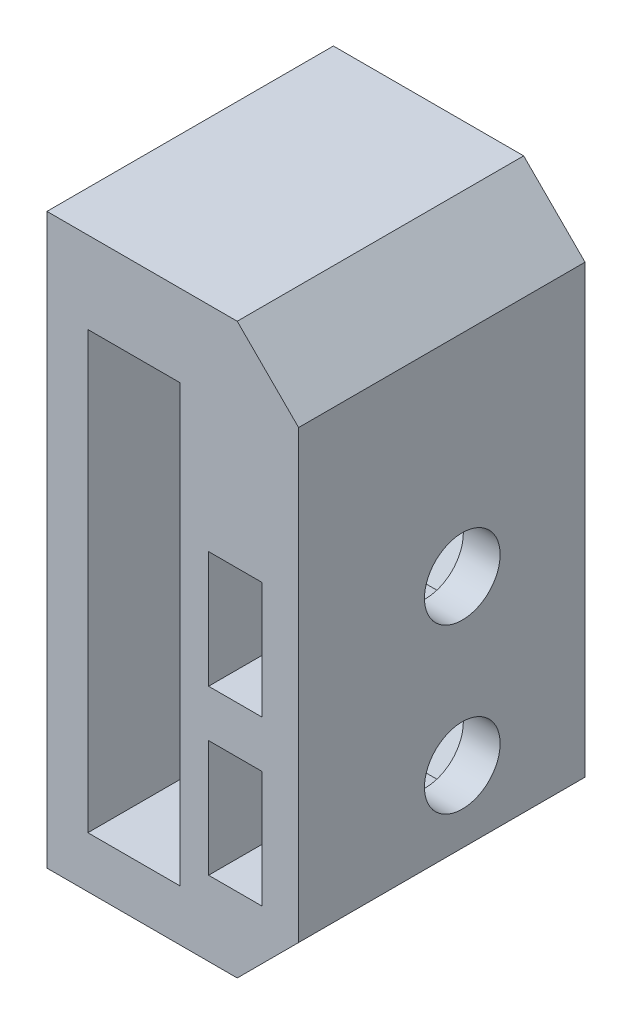
ISO-10303-21;
HEADER;
FILE_DESCRIPTION(('STEP AP214'),'2;1');
FILE_NAME('part.step','',(''),(''),'','','');
FILE_SCHEMA(('AUTOMOTIVE_DESIGN { 1 0 10303 214 1 1 1 1 }'));
ENDSEC;
DATA;
#1=APPLICATION_CONTEXT('core data for automotive mechanical design processes');
#2=APPLICATION_PROTOCOL_DEFINITION('international standard','automotive_design',2000,#1);
#3=PRODUCT_CONTEXT('',#1,'mechanical');
#4=PRODUCT('Part','Part','',(#3));
#5=PRODUCT_RELATED_PRODUCT_CATEGORY('part','',(#4));
#6=PRODUCT_DEFINITION_FORMATION('','',#4);
#7=PRODUCT_DEFINITION_CONTEXT('part definition',#1,'design');
#8=PRODUCT_DEFINITION('design','',#6,#7);
#9=PRODUCT_DEFINITION_SHAPE('','',#8);
#10=(LENGTH_UNIT() NAMED_UNIT(*) SI_UNIT(.MILLI.,.METRE.));
#11=(NAMED_UNIT(*) PLANE_ANGLE_UNIT() SI_UNIT($,.RADIAN.));
#12=(NAMED_UNIT(*) SI_UNIT($,.STERADIAN.) SOLID_ANGLE_UNIT());
#13=UNCERTAINTY_MEASURE_WITH_UNIT(LENGTH_MEASURE(1.E-05),#10,'distance_accuracy_value','');
#14=(GEOMETRIC_REPRESENTATION_CONTEXT(3) GLOBAL_UNCERTAINTY_ASSIGNED_CONTEXT((#13)) GLOBAL_UNIT_ASSIGNED_CONTEXT((#10,
#11,#12)) REPRESENTATION_CONTEXT('',''));
#15=CARTESIAN_POINT('',(0.,0.,0.));
#16=DIRECTION('',(0.,0.,1.));
#17=DIRECTION('',(1.,0.,0.));
#18=AXIS2_PLACEMENT_3D('',#15,#16,#17);
#19=CARTESIAN_POINT('',(8.49999999999995,6.85000000000002,5.02670669525396));
#20=DIRECTION('',(0.,1.,0.));
#21=DIRECTION('',(0.,0.,1.));
#22=AXIS2_PLACEMENT_3D('',#19,#20,#21);
#23=PLANE('',#22);
#24=DIRECTION('',(0.,0.,1.));
#25=VECTOR('',#24,1.);
#26=CARTESIAN_POINT('',(5.90000000000002,6.85000000000002,5.02670669525396));
#27=LINE('',#26,#25);
#28=CARTESIAN_POINT('',(5.90000000000002,6.85000000000002,1.85455173280957));
#29=VERTEX_POINT('',#28);
#30=CARTESIAN_POINT('',(5.90000000000002,6.85000000000002,11.5));
#31=VERTEX_POINT('',#30);
#32=EDGE_CURVE('E299',#29,#31,#27,.T.);
#33=ORIENTED_EDGE('',*,*,#32,.F.);
#34=DIRECTION('',(-1.,0.,0.));
#35=VECTOR('',#34,1.);
#36=CARTESIAN_POINT('',(8.49999999999995,6.85000000000002,1.85455173280957));
#37=LINE('',#36,#35);
#38=CARTESIAN_POINT('',(8.49999999999995,6.85000000000002,1.85455173280957));
#39=VERTEX_POINT('',#38);
#40=EDGE_CURVE('E342',#39,#29,#37,.T.);
#41=ORIENTED_EDGE('',*,*,#40,.F.);
#42=DIRECTION('',(0.,0.,-1.));
#43=VECTOR('',#42,1.);
#44=CARTESIAN_POINT('',(8.49999999999995,6.85000000000002,5.02670669525396));
#45=LINE('',#44,#43);
#46=CARTESIAN_POINT('',(8.49999999999995,6.85000000000002,11.5));
#47=VERTEX_POINT('',#46);
#48=EDGE_CURVE('E309',#47,#39,#45,.T.);
#49=ORIENTED_EDGE('',*,*,#48,.F.);
#50=DIRECTION('',(-1.,0.,0.));
#51=VECTOR('',#50,1.);
#52=CARTESIAN_POINT('',(8.49999999999995,6.85000000000002,11.5));
#53=LINE('',#52,#51);
#54=EDGE_CURVE('E303',#47,#31,#53,.T.);
#55=ORIENTED_EDGE('',*,*,#54,.T.);
#56=EDGE_LOOP('',(#33,#41,#49,#55));
#57=FACE_BOUND('',#56,.T.);
#58=ADVANCED_FACE('F71',(#57),#23,.F.);
#59=CARTESIAN_POINT('',(8.49999999999995,1.14999999999998,11.5));
#60=DIRECTION('',(0.,-1.,0.));
#61=DIRECTION('',(0.,0.,-1.));
#62=AXIS2_PLACEMENT_3D('',#59,#60,#61);
#63=PLANE('',#62);
#64=DIRECTION('',(0.,0.,-1.));
#65=VECTOR('',#64,1.);
#66=CARTESIAN_POINT('',(5.90000000000002,1.14999999999998,11.5));
#67=LINE('',#66,#65);
#68=CARTESIAN_POINT('',(5.90000000000002,1.14999999999998,11.5));
#69=VERTEX_POINT('',#68);
#70=CARTESIAN_POINT('',(5.90000000000002,1.14999999999998,1.85455173280957));
#71=VERTEX_POINT('',#70);
#72=EDGE_CURVE('E295',#69,#71,#67,.T.);
#73=ORIENTED_EDGE('',*,*,#72,.F.);
#74=DIRECTION('',(-1.,0.,0.));
#75=VECTOR('',#74,1.);
#76=CARTESIAN_POINT('',(8.49999999999995,1.14999999999998,11.5));
#77=LINE('',#76,#75);
#78=CARTESIAN_POINT('',(8.49999999999995,1.14999999999998,11.5));
#79=VERTEX_POINT('',#78);
#80=EDGE_CURVE('E355',#79,#69,#77,.T.);
#81=ORIENTED_EDGE('',*,*,#80,.F.);
#82=DIRECTION('',(0.,0.,1.));
#83=VECTOR('',#82,1.);
#84=CARTESIAN_POINT('',(8.49999999999995,1.14999999999998,1.85455173280957));
#85=LINE('',#84,#83);
#86=CARTESIAN_POINT('',(8.49999999999995,1.14999999999998,1.85455173280957));
#87=VERTEX_POINT('',#86);
#88=EDGE_CURVE('E364',#87,#79,#85,.T.);
#89=ORIENTED_EDGE('',*,*,#88,.F.);
#90=DIRECTION('',(-1.,0.,0.));
#91=VECTOR('',#90,1.);
#92=CARTESIAN_POINT('',(8.49999999999995,1.14999999999998,1.85455173280957));
#93=LINE('',#92,#91);
#94=EDGE_CURVE('E351',#87,#71,#93,.T.);
#95=ORIENTED_EDGE('',*,*,#94,.T.);
#96=EDGE_LOOP('',(#73,#81,#89,#95));
#97=FACE_BOUND('',#96,.T.);
#98=ADVANCED_FACE('F492',(#97),#63,.F.);
#99=CARTESIAN_POINT('',(8.49999999999995,4.,0.209103465619087));
#100=DIRECTION('',(0.,-0.5,-0.866025403784439));
#101=DIRECTION('',(0.,0.866025403784439,-0.5));
#102=AXIS2_PLACEMENT_3D('',#99,#100,#101);
#103=PLANE('',#102);
#104=DIRECTION('',(0.,0.866025403784439,-0.5));
#105=VECTOR('',#104,1.);
#106=CARTESIAN_POINT('',(5.90000000000002,4.,0.209103465619087));
#107=LINE('',#106,#105);
#108=CARTESIAN_POINT('',(5.90000000000002,4.,0.209103465619087));
#109=VERTEX_POINT('',#108);
#110=EDGE_CURVE('E291',#71,#109,#107,.T.);
#111=ORIENTED_EDGE('',*,*,#110,.F.);
#112=ORIENTED_EDGE('',*,*,#94,.F.);
#113=DIRECTION('',(0.,-0.866025403784439,0.5));
#114=VECTOR('',#113,1.);
#115=CARTESIAN_POINT('',(8.49999999999995,4.,0.209103465619087));
#116=LINE('',#115,#114);
#117=CARTESIAN_POINT('',(8.49999999999995,4.,0.209103465619087));
#118=VERTEX_POINT('',#117);
#119=EDGE_CURVE('E367',#118,#87,#116,.T.);
#120=ORIENTED_EDGE('',*,*,#119,.F.);
#121=DIRECTION('',(-1.,0.,0.));
#122=VECTOR('',#121,1.);
#123=CARTESIAN_POINT('',(8.49999999999995,4.,0.209103465619087));
#124=LINE('',#123,#122);
#125=EDGE_CURVE('E347',#118,#109,#124,.T.);
#126=ORIENTED_EDGE('',*,*,#125,.T.);
#127=EDGE_LOOP('',(#111,#112,#120,#126));
#128=FACE_BOUND('',#127,.T.);
#129=ADVANCED_FACE('F499',(#128),#103,.F.);
#130=CARTESIAN_POINT('',(8.49999999999995,6.85000000000002,1.85455173280957));
#131=DIRECTION('',(0.,0.5,-0.866025403784439));
#132=DIRECTION('',(0.,0.866025403784439,0.5));
#133=AXIS2_PLACEMENT_3D('',#130,#131,#132);
#134=PLANE('',#133);
#135=DIRECTION('',(0.,0.866025403784439,0.5));
#136=VECTOR('',#135,1.);
#137=CARTESIAN_POINT('',(5.90000000000002,6.85000000000002,1.85455173280957));
#138=LINE('',#137,#136);
#139=EDGE_CURVE('E287',#109,#29,#138,.T.);
#140=ORIENTED_EDGE('',*,*,#139,.F.);
#141=ORIENTED_EDGE('',*,*,#125,.F.);
#142=DIRECTION('',(0.,-0.866025403784439,-0.5));
#143=VECTOR('',#142,1.);
#144=CARTESIAN_POINT('',(8.49999999999995,6.85000000000002,1.85455173280957));
#145=LINE('',#144,#143);
#146=EDGE_CURVE('E371',#39,#118,#145,.T.);
#147=ORIENTED_EDGE('',*,*,#146,.F.);
#148=ORIENTED_EDGE('',*,*,#40,.T.);
#149=EDGE_LOOP('',(#140,#141,#147,#148));
#150=FACE_BOUND('',#149,.T.);
#151=ADVANCED_FACE('F570',(#150),#134,.F.);
#152=CARTESIAN_POINT('',(8.49999999999995,14.85,6.27966095384147));
#153=DIRECTION('',(0.,1.,0.));
#154=DIRECTION('',(0.,0.,1.));
#155=AXIS2_PLACEMENT_3D('',#152,#153,#154);
#156=PLANE('',#155);
#157=DIRECTION('',(0.,0.,1.));
#158=VECTOR('',#157,1.);
#159=CARTESIAN_POINT('',(5.90000000000002,14.85,6.27966095384147));
#160=LINE('',#159,#158);
#161=CARTESIAN_POINT('',(5.90000000000002,14.85,1.85455173280957));
#162=VERTEX_POINT('',#161);
#163=CARTESIAN_POINT('',(5.90000000000002,14.85,11.5));
#164=VERTEX_POINT('',#163);
#165=EDGE_CURVE('E283',#162,#164,#160,.T.);
#166=ORIENTED_EDGE('',*,*,#165,.F.);
#167=DIRECTION('',(-1.,0.,0.));
#168=VECTOR('',#167,1.);
#169=CARTESIAN_POINT('',(8.49999999999995,14.85,1.85455173280957));
#170=LINE('',#169,#168);
#171=CARTESIAN_POINT('',(8.49999999999995,14.85,1.85455173280957));
#172=VERTEX_POINT('',#171);
#173=EDGE_CURVE('E324',#172,#162,#170,.T.);
#174=ORIENTED_EDGE('',*,*,#173,.F.);
#175=DIRECTION('',(0.,0.,-1.));
#176=VECTOR('',#175,1.);
#177=CARTESIAN_POINT('',(8.49999999999995,14.85,6.27966095384147));
#178=LINE('',#177,#176);
#179=CARTESIAN_POINT('',(8.49999999999995,14.85,11.5));
#180=VERTEX_POINT('',#179);
#181=EDGE_CURVE('E304',#180,#172,#178,.T.);
#182=ORIENTED_EDGE('',*,*,#181,.F.);
#183=DIRECTION('',(-1.,0.,0.));
#184=VECTOR('',#183,1.);
#185=CARTESIAN_POINT('',(8.49999999999995,14.85,11.5));
#186=LINE('',#185,#184);
#187=EDGE_CURVE('E232',#180,#164,#186,.T.);
#188=ORIENTED_EDGE('',*,*,#187,.T.);
#189=EDGE_LOOP('',(#166,#174,#182,#188));
#190=FACE_BOUND('',#189,.T.);
#191=ADVANCED_FACE('F556',(#190),#156,.F.);
#192=CARTESIAN_POINT('',(8.49999999999995,9.14999999999999,11.5));
#193=DIRECTION('',(0.,-1.,0.));
#194=DIRECTION('',(0.,0.,-1.));
#195=AXIS2_PLACEMENT_3D('',#192,#193,#194);
#196=PLANE('',#195);
#197=DIRECTION('',(0.,0.,-1.));
#198=VECTOR('',#197,1.);
#199=CARTESIAN_POINT('',(5.90000000000002,9.14999999999999,11.5));
#200=LINE('',#199,#198);
#201=CARTESIAN_POINT('',(5.90000000000002,9.14999999999999,11.5));
#202=VERTEX_POINT('',#201);
#203=CARTESIAN_POINT('',(5.90000000000002,9.14999999999999,1.85455173280957));
#204=VERTEX_POINT('',#203);
#205=EDGE_CURVE('E279',#202,#204,#200,.T.);
#206=ORIENTED_EDGE('',*,*,#205,.F.);
#207=DIRECTION('',(-1.,0.,0.));
#208=VECTOR('',#207,1.);
#209=CARTESIAN_POINT('',(8.49999999999995,9.14999999999999,11.5));
#210=LINE('',#209,#208);
#211=CARTESIAN_POINT('',(8.49999999999995,9.14999999999999,11.5));
#212=VERTEX_POINT('',#211);
#213=EDGE_CURVE('E327',#212,#202,#210,.T.);
#214=ORIENTED_EDGE('',*,*,#213,.F.);
#215=DIRECTION('',(0.,0.,1.));
#216=VECTOR('',#215,1.);
#217=CARTESIAN_POINT('',(8.49999999999995,9.14999999999999,1.85455173280957));
#218=LINE('',#217,#216);
#219=CARTESIAN_POINT('',(8.49999999999995,9.14999999999999,1.85455173280957));
#220=VERTEX_POINT('',#219);
#221=EDGE_CURVE('E317',#220,#212,#218,.T.);
#222=ORIENTED_EDGE('',*,*,#221,.F.);
#223=DIRECTION('',(-1.,0.,0.));
#224=VECTOR('',#223,1.);
#225=CARTESIAN_POINT('',(8.49999999999995,9.14999999999999,1.85455173280957));
#226=LINE('',#225,#224);
#227=EDGE_CURVE('E331',#220,#204,#226,.T.);
#228=ORIENTED_EDGE('',*,*,#227,.T.);
#229=EDGE_LOOP('',(#206,#214,#222,#228));
#230=FACE_BOUND('',#229,.T.);
#231=ADVANCED_FACE('F560',(#230),#196,.F.);
#232=CARTESIAN_POINT('',(8.49999999999995,12.,0.209103465619087));
#233=DIRECTION('',(0.,-0.5,-0.866025403784438));
#234=DIRECTION('',(0.,0.866025403784439,-0.5));
#235=AXIS2_PLACEMENT_3D('',#232,#233,#234);
#236=PLANE('',#235);
#237=DIRECTION('',(0.,0.866025403784439,-0.5));
#238=VECTOR('',#237,1.);
#239=CARTESIAN_POINT('',(5.90000000000002,12.,0.209103465619087));
#240=LINE('',#239,#238);
#241=CARTESIAN_POINT('',(5.90000000000002,12.,0.209103465619087));
#242=VERTEX_POINT('',#241);
#243=EDGE_CURVE('E275',#204,#242,#240,.T.);
#244=ORIENTED_EDGE('',*,*,#243,.F.);
#245=ORIENTED_EDGE('',*,*,#227,.F.);
#246=DIRECTION('',(0.,-0.866025403784438,0.5));
#247=VECTOR('',#246,1.);
#248=CARTESIAN_POINT('',(8.49999999999995,12.,0.209103465619087));
#249=LINE('',#248,#247);
#250=CARTESIAN_POINT('',(8.49999999999995,12.,0.209103465619087));
#251=VERTEX_POINT('',#250);
#252=EDGE_CURVE('E313',#251,#220,#249,.T.);
#253=ORIENTED_EDGE('',*,*,#252,.F.);
#254=DIRECTION('',(-1.,0.,0.));
#255=VECTOR('',#254,1.);
#256=CARTESIAN_POINT('',(8.49999999999995,12.,0.209103465619087));
#257=LINE('',#256,#255);
#258=EDGE_CURVE('E335',#251,#242,#257,.T.);
#259=ORIENTED_EDGE('',*,*,#258,.T.);
#260=EDGE_LOOP('',(#244,#245,#253,#259));
#261=FACE_BOUND('',#260,.T.);
#262=ADVANCED_FACE('F488',(#261),#236,.F.);
#263=CARTESIAN_POINT('',(8.49999999999995,14.85,1.85455173280957));
#264=DIRECTION('',(0.,0.5,-0.866025403784439));
#265=DIRECTION('',(0.,0.866025403784438,0.5));
#266=AXIS2_PLACEMENT_3D('',#263,#264,#265);
#267=PLANE('',#266);
#268=DIRECTION('',(0.,0.866025403784438,0.5));
#269=VECTOR('',#268,1.);
#270=CARTESIAN_POINT('',(5.90000000000002,14.85,1.85455173280957));
#271=LINE('',#270,#269);
#272=EDGE_CURVE('E438',#242,#162,#271,.T.);
#273=ORIENTED_EDGE('',*,*,#272,.F.);
#274=ORIENTED_EDGE('',*,*,#258,.F.);
#275=DIRECTION('',(0.,-0.866025403784438,-0.5));
#276=VECTOR('',#275,1.);
#277=CARTESIAN_POINT('',(8.49999999999995,14.85,1.85455173280957));
#278=LINE('',#277,#276);
#279=EDGE_CURVE('E308',#172,#251,#278,.T.);
#280=ORIENTED_EDGE('',*,*,#279,.F.);
#281=ORIENTED_EDGE('',*,*,#173,.T.);
#282=EDGE_LOOP('',(#273,#274,#280,#281));
#283=FACE_BOUND('',#282,.T.);
#284=ADVANCED_FACE('F478',(#283),#267,.F.);
#285=CARTESIAN_POINT('',(4.49999999999995,-2.49999999999995,0.));
#286=DIRECTION('',(0.,1.,0.));
#287=DIRECTION('',(0.,0.,1.));
#288=AXIS2_PLACEMENT_3D('',#285,#286,#287);
#289=PLANE('',#288);
#290=DIRECTION('',(-1.,0.,0.));
#291=VECTOR('',#290,1.);
#292=CARTESIAN_POINT('',(4.49999999999995,-2.49999999999995,-2.49999999999995));
#293=LINE('',#292,#291);
#294=CARTESIAN_POINT('',(7.30000000000008,-2.49999999999995,-2.49999999999995));
#295=VERTEX_POINT('',#294);
#296=CARTESIAN_POINT('',(-2.,-2.49999999999995,-2.49999999999995));
#297=VERTEX_POINT('',#296);
#298=EDGE_CURVE('E226',#295,#297,#293,.T.);
#299=ORIENTED_EDGE('',*,*,#298,.F.);
#300=DIRECTION('',(0.,0.,1.));
#301=VECTOR('',#300,1.);
#302=CARTESIAN_POINT('',(7.30000000000008,-2.50000000000006,11.5));
#303=LINE('',#302,#301);
#304=CARTESIAN_POINT('',(7.30000000000008,-2.50000000000006,11.5));
#305=VERTEX_POINT('',#304);
#306=EDGE_CURVE('E12',#295,#305,#303,.T.);
#307=ORIENTED_EDGE('',*,*,#306,.T.);
#308=DIRECTION('',(-1.,0.,0.));
#309=VECTOR('',#308,1.);
#310=CARTESIAN_POINT('',(4.49999999999995,-2.50000000000006,11.5));
#311=LINE('',#310,#309);
#312=CARTESIAN_POINT('',(-2.,-2.49999999999995,11.5));
#313=VERTEX_POINT('',#312);
#314=EDGE_CURVE('E418',#305,#313,#311,.T.);
#315=ORIENTED_EDGE('',*,*,#314,.T.);
#316=DIRECTION('',(0.,0.,1.));
#317=VECTOR('',#316,1.);
#318=CARTESIAN_POINT('',(-2.,-2.49999999999995,11.5));
#319=LINE('',#318,#317);
#320=EDGE_CURVE('E231',#297,#313,#319,.T.);
#321=ORIENTED_EDGE('',*,*,#320,.F.);
#322=EDGE_LOOP('',(#299,#307,#315,#321));
#323=FACE_BOUND('',#322,.T.);
#324=ADVANCED_FACE('F476',(#323),#289,.F.);
#325=CARTESIAN_POINT('',(4.49999999999995,0.,-2.49999999999995));
#326=DIRECTION('',(0.,0.,1.));
#327=DIRECTION('',(0.,-1.,0.));
#328=AXIS2_PLACEMENT_3D('',#325,#326,#327);
#329=PLANE('',#328);
#330=DIRECTION('',(-1.,0.,0.));
#331=VECTOR('',#330,1.);
#332=CARTESIAN_POINT('',(10.3,25.3,-2.49999999999995));
#333=LINE('',#332,#331);
#334=CARTESIAN_POINT('',(7.30000000000008,25.3,-2.49999999999995));
#335=VERTEX_POINT('',#334);
#336=CARTESIAN_POINT('',(-2.,25.3,-2.49999999999995));
#337=VERTEX_POINT('',#336);
#338=EDGE_CURVE('E211',#335,#337,#333,.T.);
#339=ORIENTED_EDGE('',*,*,#338,.F.);
#340=DIRECTION('',(-0.707106781186546,0.707106781186549,0.));
#341=VECTOR('',#340,1.);
#342=CARTESIAN_POINT('',(7.30000000000008,25.3,-2.49999999999995));
#343=LINE('',#342,#341);
#344=CARTESIAN_POINT('',(10.3,22.3,-2.49999999999995));
#345=VERTEX_POINT('',#344);
#346=EDGE_CURVE('E453',#335,#345,#343,.F.);
#347=ORIENTED_EDGE('',*,*,#346,.T.);
#348=DIRECTION('',(0.,1.,0.));
#349=VECTOR('',#348,1.);
#350=CARTESIAN_POINT('',(10.3,-2.50000000000006,-2.49999999999995));
#351=LINE('',#350,#349);
#352=CARTESIAN_POINT('',(10.3,0.499999999999945,-2.49999999999995));
#353=VERTEX_POINT('',#352);
#354=EDGE_CURVE('E382',#353,#345,#351,.T.);
#355=ORIENTED_EDGE('',*,*,#354,.F.);
#356=DIRECTION('',(-0.707106781186549,-0.707106781186546,0.));
#357=VECTOR('',#356,1.);
#358=CARTESIAN_POINT('',(10.3,0.499999999999945,-2.49999999999995));
#359=LINE('',#358,#357);
#360=EDGE_CURVE('E450',#353,#295,#359,.T.);
#361=ORIENTED_EDGE('',*,*,#360,.T.);
#362=ORIENTED_EDGE('',*,*,#298,.T.);
#363=DIRECTION('',(0.,-1.,0.));
#364=VECTOR('',#363,1.);
#365=CARTESIAN_POINT('',(-2.,23.8,-2.49999999999995));
#366=LINE('',#365,#364);
#367=EDGE_CURVE('E224',#337,#297,#366,.T.);
#368=ORIENTED_EDGE('',*,*,#367,.F.);
#369=EDGE_LOOP('',(#339,#347,#355,#361,#362,#368));
#370=FACE_BOUND('',#369,.T.);
#371=ADVANCED_FACE('F225',(#370),#329,.F.);
#372=CARTESIAN_POINT('',(4.49999999999995,0.,11.5));
#373=DIRECTION('',(0.,0.,-1.));
#374=DIRECTION('',(0.,1.,0.));
#375=AXIS2_PLACEMENT_3D('',#372,#373,#374);
#376=PLANE('',#375);
#377=DIRECTION('',(0.,-1.,0.));
#378=VECTOR('',#377,1.);
#379=CARTESIAN_POINT('',(4.49999999999995,0.,11.5));
#380=LINE('',#379,#378);
#381=CARTESIAN_POINT('',(4.49999999999995,21.3,11.5));
#382=VERTEX_POINT('',#381);
#383=CARTESIAN_POINT('',(4.49999999999995,0.,11.5));
#384=VERTEX_POINT('',#383);
#385=EDGE_CURVE('E427',#382,#384,#380,.T.);
#386=ORIENTED_EDGE('',*,*,#385,.T.);
#387=DIRECTION('',(-1.,0.,0.));
#388=VECTOR('',#387,1.);
#389=CARTESIAN_POINT('',(4.49999999999995,0.,11.5));
#390=LINE('',#389,#388);
#391=CARTESIAN_POINT('',(0.,0.,11.5));
#392=VERTEX_POINT('',#391);
#393=EDGE_CURVE('E430',#384,#392,#390,.T.);
#394=ORIENTED_EDGE('',*,*,#393,.T.);
#395=DIRECTION('',(0.,1.,0.));
#396=VECTOR('',#395,1.);
#397=CARTESIAN_POINT('',(0.,0.,11.5));
#398=LINE('',#397,#396);
#399=CARTESIAN_POINT('',(0.,21.3,11.5));
#400=VERTEX_POINT('',#399);
#401=EDGE_CURVE('E434',#392,#400,#398,.T.);
#402=ORIENTED_EDGE('',*,*,#401,.T.);
#403=DIRECTION('',(1.,0.,0.));
#404=VECTOR('',#403,1.);
#405=CARTESIAN_POINT('',(4.49999999999995,21.3,11.5));
#406=LINE('',#405,#404);
#407=EDGE_CURVE('E423',#400,#382,#406,.T.);
#408=ORIENTED_EDGE('',*,*,#407,.T.);
#409=EDGE_LOOP('',(#386,#394,#402,#408));
#410=FACE_BOUND('',#409,.T.);
#411=ORIENTED_EDGE('',*,*,#80,.T.);
#412=DIRECTION('',(0.,1.,0.));
#413=VECTOR('',#412,1.);
#414=CARTESIAN_POINT('',(5.90000000000002,21.3,11.5));
#415=LINE('',#414,#413);
#416=EDGE_CURVE('E274',#69,#31,#415,.T.);
#417=ORIENTED_EDGE('',*,*,#416,.T.);
#418=ORIENTED_EDGE('',*,*,#54,.F.);
#419=DIRECTION('',(0.,1.,0.));
#420=VECTOR('',#419,1.);
#421=CARTESIAN_POINT('',(8.49999999999995,6.85000000000002,11.5));
#422=LINE('',#421,#420);
#423=EDGE_CURVE('E346',#79,#47,#422,.T.);
#424=ORIENTED_EDGE('',*,*,#423,.F.);
#425=EDGE_LOOP('',(#411,#417,#418,#424));
#426=FACE_BOUND('',#425,.T.);
#427=ORIENTED_EDGE('',*,*,#213,.T.);
#428=EDGE_CURVE('E270',#202,#164,#415,.T.);
#429=ORIENTED_EDGE('',*,*,#428,.T.);
#430=ORIENTED_EDGE('',*,*,#187,.F.);
#431=DIRECTION('',(0.,1.,0.));
#432=VECTOR('',#431,1.);
#433=CARTESIAN_POINT('',(8.49999999999995,14.85,11.5));
#434=LINE('',#433,#432);
#435=EDGE_CURVE('E320',#212,#180,#434,.T.);
#436=ORIENTED_EDGE('',*,*,#435,.F.);
#437=EDGE_LOOP('',(#427,#429,#430,#436));
#438=FACE_BOUND('',#437,.T.);
#439=DIRECTION('',(0.,-1.,0.));
#440=VECTOR('',#439,1.);
#441=CARTESIAN_POINT('',(10.3,-2.50000000000006,11.5));
#442=LINE('',#441,#440);
#443=CARTESIAN_POINT('',(10.3,22.3,11.5));
#444=VERTEX_POINT('',#443);
#445=CARTESIAN_POINT('',(10.3,0.499999999999945,11.5));
#446=VERTEX_POINT('',#445);
#447=EDGE_CURVE('E386',#444,#446,#442,.T.);
#448=ORIENTED_EDGE('',*,*,#447,.F.);
#449=DIRECTION('',(0.707106781186546,-0.707106781186549,0.));
#450=VECTOR('',#449,1.);
#451=CARTESIAN_POINT('',(7.30000000000008,25.3,11.5));
#452=LINE('',#451,#450);
#453=CARTESIAN_POINT('',(7.30000000000008,25.3,11.5));
#454=VERTEX_POINT('',#453);
#455=EDGE_CURVE('E81',#444,#454,#452,.F.);
#456=ORIENTED_EDGE('',*,*,#455,.T.);
#457=DIRECTION('',(1.,0.,0.));
#458=VECTOR('',#457,1.);
#459=CARTESIAN_POINT('',(-2.,25.3,11.5));
#460=LINE('',#459,#458);
#461=CARTESIAN_POINT('',(-2.,25.3,11.5));
#462=VERTEX_POINT('',#461);
#463=EDGE_CURVE('E238',#462,#454,#460,.T.);
#464=ORIENTED_EDGE('',*,*,#463,.F.);
#465=DIRECTION('',(0.,1.,0.));
#466=VECTOR('',#465,1.);
#467=CARTESIAN_POINT('',(-2.,23.8,11.5));
#468=LINE('',#467,#466);
#469=EDGE_CURVE('E236',#313,#462,#468,.T.);
#470=ORIENTED_EDGE('',*,*,#469,.F.);
#471=ORIENTED_EDGE('',*,*,#314,.F.);
#472=DIRECTION('',(0.707106781186549,0.707106781186546,0.));
#473=VECTOR('',#472,1.);
#474=CARTESIAN_POINT('',(10.3,0.499999999999945,11.5));
#475=LINE('',#474,#473);
#476=EDGE_CURVE('E93',#305,#446,#475,.T.);
#477=ORIENTED_EDGE('',*,*,#476,.T.);
#478=EDGE_LOOP('',(#448,#456,#464,#470,#471,#477));
#479=FACE_BOUND('',#478,.T.);
#480=ADVANCED_FACE('F467',(#410,#426,#438,#479),#376,.F.);
#481=CARTESIAN_POINT('',(10.3,0.,0.));
#482=DIRECTION('',(1.,0.,0.));
#483=DIRECTION('',(0.,0.,-1.));
#484=AXIS2_PLACEMENT_3D('',#481,#482,#483);
#485=PLANE('',#484);
#486=CARTESIAN_POINT('',(10.3,4.,3.49999999999995));
#487=DIRECTION('',(1.,0.,0.));
#488=DIRECTION('',(0.,0.,-1.));
#489=AXIS2_PLACEMENT_3D('',#486,#487,#488);
#490=CIRCLE('',#489,1.85);
#491=CARTESIAN_POINT('',(10.3,4.,1.64999999999995));
#492=VERTEX_POINT('',#491);
#493=EDGE_CURVE('E245',#492,#492,#490,.T.);
#494=ORIENTED_EDGE('',*,*,#493,.F.);
#495=EDGE_LOOP('',(#494));
#496=FACE_BOUND('',#495,.T.);
#497=CARTESIAN_POINT('',(10.3,12.,3.49999999999995));
#498=DIRECTION('',(1.,0.,0.));
#499=DIRECTION('',(0.,0.,-1.));
#500=AXIS2_PLACEMENT_3D('',#497,#498,#499);
#501=CIRCLE('',#500,1.85);
#502=CARTESIAN_POINT('',(10.3,12.,1.64999999999995));
#503=VERTEX_POINT('',#502);
#504=EDGE_CURVE('E242',#503,#503,#501,.T.);
#505=ORIENTED_EDGE('',*,*,#504,.F.);
#506=EDGE_LOOP('',(#505));
#507=FACE_BOUND('',#506,.T.);
#508=ORIENTED_EDGE('',*,*,#354,.T.);
#509=DIRECTION('',(0.,0.,1.));
#510=VECTOR('',#509,1.);
#511=CARTESIAN_POINT('',(10.3,22.3,0.));
#512=LINE('',#511,#510);
#513=EDGE_CURVE('E460',#345,#444,#512,.T.);
#514=ORIENTED_EDGE('',*,*,#513,.T.);
#515=ORIENTED_EDGE('',*,*,#447,.T.);
#516=DIRECTION('',(0.,0.,-1.));
#517=VECTOR('',#516,1.);
#518=CARTESIAN_POINT('',(10.3,0.499999999999945,-2.49999999999995));
#519=LINE('',#518,#517);
#520=EDGE_CURVE('E456',#446,#353,#519,.T.);
#521=ORIENTED_EDGE('',*,*,#520,.T.);
#522=EDGE_LOOP('',(#508,#514,#515,#521));
#523=FACE_BOUND('',#522,.T.);
#524=ADVANCED_FACE('F473',(#496,#507,#523),#485,.T.);
#525=CARTESIAN_POINT('',(-2.,0.,0.));
#526=DIRECTION('',(-1.,0.,0.));
#527=DIRECTION('',(0.,0.,1.));
#528=AXIS2_PLACEMENT_3D('',#525,#526,#527);
#529=PLANE('',#528);
#530=ORIENTED_EDGE('',*,*,#469,.T.);
#531=DIRECTION('',(0.,0.,1.));
#532=VECTOR('',#531,1.);
#533=CARTESIAN_POINT('',(-2.,25.3,-2.49999999999995));
#534=LINE('',#533,#532);
#535=EDGE_CURVE('E216',#337,#462,#534,.T.);
#536=ORIENTED_EDGE('',*,*,#535,.F.);
#537=ORIENTED_EDGE('',*,*,#367,.T.);
#538=ORIENTED_EDGE('',*,*,#320,.T.);
#539=EDGE_LOOP('',(#530,#536,#537,#538));
#540=FACE_BOUND('',#539,.T.);
#541=ADVANCED_FACE('F234',(#540),#529,.T.);
#542=CARTESIAN_POINT('',(0.,0.,0.));
#543=DIRECTION('',(-1.,0.,0.));
#544=DIRECTION('',(0.,0.,1.));
#545=AXIS2_PLACEMENT_3D('',#542,#543,#544);
#546=PLANE('',#545);
#547=DIRECTION('',(0.,0.,1.));
#548=VECTOR('',#547,1.);
#549=CARTESIAN_POINT('',(0.,21.3,0.));
#550=LINE('',#549,#548);
#551=CARTESIAN_POINT('',(0.,21.3,0.));
#552=VERTEX_POINT('',#551);
#553=EDGE_CURVE('E395',#552,#400,#550,.T.);
#554=ORIENTED_EDGE('',*,*,#553,.T.);
#555=ORIENTED_EDGE('',*,*,#401,.F.);
#556=DIRECTION('',(0.,0.,-1.));
#557=VECTOR('',#556,1.);
#558=CARTESIAN_POINT('',(0.,0.,0.));
#559=LINE('',#558,#557);
#560=CARTESIAN_POINT('',(0.,0.,0.));
#561=VERTEX_POINT('',#560);
#562=EDGE_CURVE('E389',#392,#561,#559,.T.);
#563=ORIENTED_EDGE('',*,*,#562,.T.);
#564=DIRECTION('',(0.,1.,0.));
#565=VECTOR('',#564,1.);
#566=CARTESIAN_POINT('',(0.,0.,0.));
#567=LINE('',#566,#565);
#568=EDGE_CURVE('E406',#561,#552,#567,.T.);
#569=ORIENTED_EDGE('',*,*,#568,.T.);
#570=EDGE_LOOP('',(#554,#555,#563,#569));
#571=FACE_BOUND('',#570,.T.);
#572=ADVANCED_FACE('F512',(#571),#546,.F.);
#573=CARTESIAN_POINT('',(4.49999999999995,0.,0.));
#574=DIRECTION('',(1.,0.,0.));
#575=DIRECTION('',(0.,0.,-1.));
#576=AXIS2_PLACEMENT_3D('',#573,#574,#575);
#577=PLANE('',#576);
#578=CARTESIAN_POINT('',(4.49999999999995,4.,3.49999999999995));
#579=DIRECTION('',(1.,0.,0.));
#580=DIRECTION('',(0.,0.,-1.));
#581=AXIS2_PLACEMENT_3D('',#578,#579,#580);
#582=CIRCLE('',#581,1.85);
#583=CARTESIAN_POINT('',(4.49999999999995,4.,1.64999999999995));
#584=VERTEX_POINT('',#583);
#585=EDGE_CURVE('E257',#584,#584,#582,.T.);
#586=ORIENTED_EDGE('',*,*,#585,.T.);
#587=EDGE_LOOP('',(#586));
#588=FACE_BOUND('',#587,.T.);
#589=CARTESIAN_POINT('',(4.49999999999995,12.,3.49999999999995));
#590=DIRECTION('',(1.,0.,0.));
#591=DIRECTION('',(0.,0.,-1.));
#592=AXIS2_PLACEMENT_3D('',#589,#590,#591);
#593=CIRCLE('',#592,1.85);
#594=CARTESIAN_POINT('',(4.49999999999995,12.,1.64999999999995));
#595=VERTEX_POINT('',#594);
#596=EDGE_CURVE('E266',#595,#595,#593,.T.);
#597=ORIENTED_EDGE('',*,*,#596,.T.);
#598=EDGE_LOOP('',(#597));
#599=FACE_BOUND('',#598,.T.);
#600=DIRECTION('',(0.,0.,-1.));
#601=VECTOR('',#600,1.);
#602=CARTESIAN_POINT('',(4.49999999999995,0.,0.));
#603=LINE('',#602,#601);
#604=CARTESIAN_POINT('',(4.49999999999995,0.,0.));
#605=VERTEX_POINT('',#604);
#606=EDGE_CURVE('E390',#384,#605,#603,.T.);
#607=ORIENTED_EDGE('',*,*,#606,.F.);
#608=ORIENTED_EDGE('',*,*,#385,.F.);
#609=DIRECTION('',(0.,0.,1.));
#610=VECTOR('',#609,1.);
#611=CARTESIAN_POINT('',(4.49999999999995,21.3,0.));
#612=LINE('',#611,#610);
#613=CARTESIAN_POINT('',(4.49999999999995,21.3,0.));
#614=VERTEX_POINT('',#613);
#615=EDGE_CURVE('E399',#614,#382,#612,.T.);
#616=ORIENTED_EDGE('',*,*,#615,.F.);
#617=DIRECTION('',(0.,1.,0.));
#618=VECTOR('',#617,1.);
#619=CARTESIAN_POINT('',(4.49999999999995,0.,0.));
#620=LINE('',#619,#618);
#621=EDGE_CURVE('E394',#605,#614,#620,.T.);
#622=ORIENTED_EDGE('',*,*,#621,.F.);
#623=EDGE_LOOP('',(#607,#608,#616,#622));
#624=FACE_BOUND('',#623,.T.);
#625=ADVANCED_FACE('F515',(#588,#599,#624),#577,.F.);
#626=CARTESIAN_POINT('',(4.49999999999995,21.3,0.));
#627=DIRECTION('',(0.,-1.,0.));
#628=DIRECTION('',(0.,0.,-1.));
#629=AXIS2_PLACEMENT_3D('',#626,#627,#628);
#630=PLANE('',#629);
#631=ORIENTED_EDGE('',*,*,#553,.F.);
#632=DIRECTION('',(-1.,0.,0.));
#633=VECTOR('',#632,1.);
#634=CARTESIAN_POINT('',(4.49999999999995,21.3,0.));
#635=LINE('',#634,#633);
#636=EDGE_CURVE('E402',#614,#552,#635,.T.);
#637=ORIENTED_EDGE('',*,*,#636,.F.);
#638=ORIENTED_EDGE('',*,*,#615,.T.);
#639=ORIENTED_EDGE('',*,*,#407,.F.);
#640=EDGE_LOOP('',(#631,#637,#638,#639));
#641=FACE_BOUND('',#640,.T.);
#642=ADVANCED_FACE('F522',(#641),#630,.T.);
#643=CARTESIAN_POINT('',(4.49999999999995,0.,0.));
#644=DIRECTION('',(0.,0.,1.));
#645=DIRECTION('',(0.,-1.,0.));
#646=AXIS2_PLACEMENT_3D('',#643,#644,#645);
#647=PLANE('',#646);
#648=ORIENTED_EDGE('',*,*,#568,.F.);
#649=DIRECTION('',(-1.,0.,0.));
#650=VECTOR('',#649,1.);
#651=CARTESIAN_POINT('',(4.49999999999995,0.,0.));
#652=LINE('',#651,#650);
#653=EDGE_CURVE('E414',#605,#561,#652,.T.);
#654=ORIENTED_EDGE('',*,*,#653,.F.);
#655=ORIENTED_EDGE('',*,*,#621,.T.);
#656=ORIENTED_EDGE('',*,*,#636,.T.);
#657=EDGE_LOOP('',(#648,#654,#655,#656));
#658=FACE_BOUND('',#657,.T.);
#659=ADVANCED_FACE('F526',(#658),#647,.T.);
#660=CARTESIAN_POINT('',(4.49999999999995,0.,0.));
#661=DIRECTION('',(0.,1.,0.));
#662=DIRECTION('',(0.,0.,1.));
#663=AXIS2_PLACEMENT_3D('',#660,#661,#662);
#664=PLANE('',#663);
#665=ORIENTED_EDGE('',*,*,#562,.F.);
#666=ORIENTED_EDGE('',*,*,#393,.F.);
#667=ORIENTED_EDGE('',*,*,#606,.T.);
#668=ORIENTED_EDGE('',*,*,#653,.T.);
#669=EDGE_LOOP('',(#665,#666,#667,#668));
#670=FACE_BOUND('',#669,.T.);
#671=ADVANCED_FACE('F508',(#670),#664,.T.);
#672=CARTESIAN_POINT('',(8.49999999999995,0.,0.));
#673=DIRECTION('',(-1.,0.,0.));
#674=DIRECTION('',(0.,0.,1.));
#675=AXIS2_PLACEMENT_3D('',#672,#673,#674);
#676=PLANE('',#675);
#677=CARTESIAN_POINT('',(8.49999999999995,4.,3.49999999999995));
#678=DIRECTION('',(-1.,0.,0.));
#679=DIRECTION('',(0.,0.,1.));
#680=AXIS2_PLACEMENT_3D('',#677,#678,#679);
#681=CIRCLE('',#680,1.85);
#682=CARTESIAN_POINT('',(8.49999999999995,4.,5.34999999999995));
#683=VERTEX_POINT('',#682);
#684=EDGE_CURVE('E253',#683,#683,#681,.T.);
#685=ORIENTED_EDGE('',*,*,#684,.F.);
#686=EDGE_LOOP('',(#685));
#687=FACE_BOUND('',#686,.T.);
#688=ORIENTED_EDGE('',*,*,#48,.T.);
#689=ORIENTED_EDGE('',*,*,#146,.T.);
#690=ORIENTED_EDGE('',*,*,#119,.T.);
#691=ORIENTED_EDGE('',*,*,#88,.T.);
#692=ORIENTED_EDGE('',*,*,#423,.T.);
#693=EDGE_LOOP('',(#688,#689,#690,#691,#692));
#694=FACE_BOUND('',#693,.T.);
#695=ADVANCED_FACE('F504',(#687,#694),#676,.T.);
#696=CARTESIAN_POINT('',(8.49999999999995,0.,0.));
#697=DIRECTION('',(-1.,0.,0.));
#698=DIRECTION('',(0.,0.,1.));
#699=AXIS2_PLACEMENT_3D('',#696,#697,#698);
#700=PLANE('',#699);
#701=CARTESIAN_POINT('',(8.49999999999995,12.,3.49999999999995));
#702=DIRECTION('',(-1.,0.,0.));
#703=DIRECTION('',(0.,0.,1.));
#704=AXIS2_PLACEMENT_3D('',#701,#702,#703);
#705=CIRCLE('',#704,1.85);
#706=CARTESIAN_POINT('',(8.49999999999995,12.,5.34999999999995));
#707=VERTEX_POINT('',#706);
#708=EDGE_CURVE('E262',#707,#707,#705,.T.);
#709=ORIENTED_EDGE('',*,*,#708,.F.);
#710=EDGE_LOOP('',(#709));
#711=FACE_BOUND('',#710,.T.);
#712=ORIENTED_EDGE('',*,*,#181,.T.);
#713=ORIENTED_EDGE('',*,*,#279,.T.);
#714=ORIENTED_EDGE('',*,*,#252,.T.);
#715=ORIENTED_EDGE('',*,*,#221,.T.);
#716=ORIENTED_EDGE('',*,*,#435,.T.);
#717=EDGE_LOOP('',(#712,#713,#714,#715,#716));
#718=FACE_BOUND('',#717,.T.);
#719=ADVANCED_FACE('F507',(#711,#718),#700,.T.);
#720=CARTESIAN_POINT('',(5.90000000000002,0.,0.));
#721=DIRECTION('',(-1.,0.,0.));
#722=DIRECTION('',(0.,0.,1.));
#723=AXIS2_PLACEMENT_3D('',#720,#721,#722);
#724=PLANE('',#723);
#725=CARTESIAN_POINT('',(5.90000000000002,12.,3.49999999999995));
#726=DIRECTION('',(-1.,0.,0.));
#727=DIRECTION('',(0.,0.,1.));
#728=AXIS2_PLACEMENT_3D('',#725,#726,#727);
#729=CIRCLE('',#728,1.85);
#730=CARTESIAN_POINT('',(5.90000000000002,12.,5.34999999999995));
#731=VERTEX_POINT('',#730);
#732=EDGE_CURVE('E261',#731,#731,#729,.T.);
#733=ORIENTED_EDGE('',*,*,#732,.T.);
#734=EDGE_LOOP('',(#733));
#735=FACE_BOUND('',#734,.T.);
#736=ORIENTED_EDGE('',*,*,#272,.T.);
#737=ORIENTED_EDGE('',*,*,#165,.T.);
#738=ORIENTED_EDGE('',*,*,#428,.F.);
#739=ORIENTED_EDGE('',*,*,#205,.T.);
#740=ORIENTED_EDGE('',*,*,#243,.T.);
#741=EDGE_LOOP('',(#736,#737,#738,#739,#740));
#742=FACE_BOUND('',#741,.T.);
#743=ADVANCED_FACE('F554',(#735,#742),#724,.F.);
#744=CARTESIAN_POINT('',(5.90000000000002,4.,3.49999999999995));
#745=DIRECTION('',(-1.,0.,0.));
#746=DIRECTION('',(0.,0.,1.));
#747=AXIS2_PLACEMENT_3D('',#744,#745,#746);
#748=CIRCLE('',#747,1.85);
#749=CARTESIAN_POINT('',(5.90000000000002,4.,5.34999999999995));
#750=VERTEX_POINT('',#749);
#751=EDGE_CURVE('E249',#750,#750,#748,.T.);
#752=ORIENTED_EDGE('',*,*,#751,.T.);
#753=EDGE_LOOP('',(#752));
#754=FACE_BOUND('',#753,.T.);
#755=ORIENTED_EDGE('',*,*,#139,.T.);
#756=ORIENTED_EDGE('',*,*,#32,.T.);
#757=ORIENTED_EDGE('',*,*,#416,.F.);
#758=ORIENTED_EDGE('',*,*,#72,.T.);
#759=ORIENTED_EDGE('',*,*,#110,.T.);
#760=EDGE_LOOP('',(#755,#756,#757,#758,#759));
#761=FACE_BOUND('',#760,.T.);
#762=ADVANCED_FACE('F580',(#754,#761),#724,.F.);
#763=CARTESIAN_POINT('',(0.299999999999967,4.,3.49999999999995));
#764=DIRECTION('',(1.,0.,0.));
#765=DIRECTION('',(0.,0.,-1.));
#766=AXIS2_PLACEMENT_3D('',#763,#764,#765);
#767=CYLINDRICAL_SURFACE('',#766,1.85);
#768=ORIENTED_EDGE('',*,*,#751,.F.);
#769=EDGE_LOOP('',(#768));
#770=FACE_BOUND('',#769,.T.);
#771=ORIENTED_EDGE('',*,*,#585,.F.);
#772=EDGE_LOOP('',(#771));
#773=FACE_BOUND('',#772,.T.);
#774=ADVANCED_FACE('F650',(#770,#773),#767,.F.);
#775=CARTESIAN_POINT('',(0.299999999999967,12.,3.49999999999995));
#776=DIRECTION('',(1.,0.,0.));
#777=DIRECTION('',(0.,0.,-1.));
#778=AXIS2_PLACEMENT_3D('',#775,#776,#777);
#779=CYLINDRICAL_SURFACE('',#778,1.85);
#780=ORIENTED_EDGE('',*,*,#732,.F.);
#781=EDGE_LOOP('',(#780));
#782=FACE_BOUND('',#781,.T.);
#783=ORIENTED_EDGE('',*,*,#596,.F.);
#784=EDGE_LOOP('',(#783));
#785=FACE_BOUND('',#784,.T.);
#786=ADVANCED_FACE('F658',(#782,#785),#779,.F.);
#787=ORIENTED_EDGE('',*,*,#708,.T.);
#788=EDGE_LOOP('',(#787));
#789=FACE_BOUND('',#788,.T.);
#790=ORIENTED_EDGE('',*,*,#504,.T.);
#791=EDGE_LOOP('',(#790));
#792=FACE_BOUND('',#791,.T.);
#793=ADVANCED_FACE('F665',(#789,#792),#779,.F.);
#794=ORIENTED_EDGE('',*,*,#684,.T.);
#795=EDGE_LOOP('',(#794));
#796=FACE_BOUND('',#795,.T.);
#797=ORIENTED_EDGE('',*,*,#493,.T.);
#798=EDGE_LOOP('',(#797));
#799=FACE_BOUND('',#798,.T.);
#800=ADVANCED_FACE('F661',(#796,#799),#767,.F.);
#801=CARTESIAN_POINT('',(0.,25.3,0.));
#802=DIRECTION('',(0.,1.,0.));
#803=DIRECTION('',(0.,0.,1.));
#804=AXIS2_PLACEMENT_3D('',#801,#802,#803);
#805=PLANE('',#804);
#806=ORIENTED_EDGE('',*,*,#463,.T.);
#807=DIRECTION('',(0.,0.,-1.));
#808=VECTOR('',#807,1.);
#809=CARTESIAN_POINT('',(7.30000000000008,25.3,0.));
#810=LINE('',#809,#808);
#811=EDGE_CURVE('E219',#454,#335,#810,.T.);
#812=ORIENTED_EDGE('',*,*,#811,.T.);
#813=ORIENTED_EDGE('',*,*,#338,.T.);
#814=ORIENTED_EDGE('',*,*,#535,.T.);
#815=EDGE_LOOP('',(#806,#812,#813,#814));
#816=FACE_BOUND('',#815,.T.);
#817=ADVANCED_FACE('F214',(#816),#805,.T.);
#818=CARTESIAN_POINT('',(7.30000000000008,25.3,0.));
#819=DIRECTION('',(-0.707106781186549,-0.707106781186546,0.));
#820=DIRECTION('',(0.,0.,-1.));
#821=AXIS2_PLACEMENT_3D('',#818,#819,#820);
#822=PLANE('',#821);
#823=ORIENTED_EDGE('',*,*,#455,.F.);
#824=ORIENTED_EDGE('',*,*,#513,.F.);
#825=ORIENTED_EDGE('',*,*,#346,.F.);
#826=ORIENTED_EDGE('',*,*,#811,.F.);
#827=EDGE_LOOP('',(#823,#824,#825,#826));
#828=FACE_BOUND('',#827,.T.);
#829=ADVANCED_FACE('F470',(#828),#822,.F.);
#830=CARTESIAN_POINT('',(10.3,0.499999999999945,0.));
#831=DIRECTION('',(0.707106781186546,-0.707106781186549,0.));
#832=DIRECTION('',(0.,0.,1.));
#833=AXIS2_PLACEMENT_3D('',#830,#831,#832);
#834=PLANE('',#833);
#835=ORIENTED_EDGE('',*,*,#476,.F.);
#836=ORIENTED_EDGE('',*,*,#306,.F.);
#837=ORIENTED_EDGE('',*,*,#360,.F.);
#838=ORIENTED_EDGE('',*,*,#520,.F.);
#839=EDGE_LOOP('',(#835,#836,#837,#838));
#840=FACE_BOUND('',#839,.T.);
#841=ADVANCED_FACE('F74',(#840),#834,.T.);
#842=CLOSED_SHELL('',(#58,#98,#129,#151,#191,#231,#262,#284,#324,#371,#480,#524,#541,#572,#625,
#642,#659,#671,#695,#719,#743,#762,#774,#786,#793,#800,#817,#829,#841));
#843=MANIFOLD_SOLID_BREP('B2',#842);
#844=ADVANCED_BREP_SHAPE_REPRESENTATION('',(#18,#843),#14);
#845=SHAPE_DEFINITION_REPRESENTATION(#9,#844);
ENDSEC;
END-ISO-10303-21;
